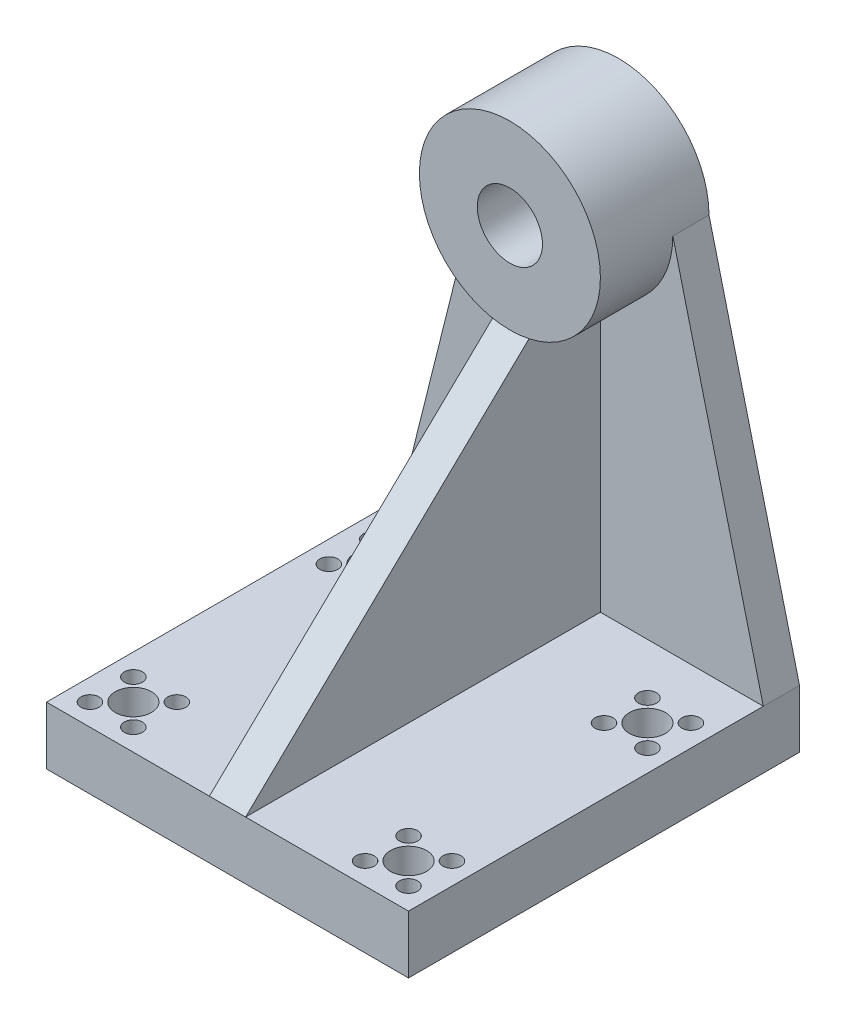
ISO-10303-21;
HEADER;
FILE_DESCRIPTION(('STEP AP214'),'2;1');
FILE_NAME('part.step','',(''),(''),'','','');
FILE_SCHEMA(('AUTOMOTIVE_DESIGN { 1 0 10303 214 1 1 1 1 }'));
ENDSEC;
DATA;
#1=APPLICATION_CONTEXT('core data for automotive mechanical design processes');
#2=APPLICATION_PROTOCOL_DEFINITION('international standard','automotive_design',2000,#1);
#3=PRODUCT_CONTEXT('',#1,'mechanical');
#4=PRODUCT('Part','Part','',(#3));
#5=PRODUCT_RELATED_PRODUCT_CATEGORY('part','',(#4));
#6=PRODUCT_DEFINITION_FORMATION('','',#4);
#7=PRODUCT_DEFINITION_CONTEXT('part definition',#1,'design');
#8=PRODUCT_DEFINITION('design','',#6,#7);
#9=PRODUCT_DEFINITION_SHAPE('','',#8);
#10=(LENGTH_UNIT() NAMED_UNIT(*) SI_UNIT(.MILLI.,.METRE.));
#11=(NAMED_UNIT(*) PLANE_ANGLE_UNIT() SI_UNIT($,.RADIAN.));
#12=(NAMED_UNIT(*) SI_UNIT($,.STERADIAN.) SOLID_ANGLE_UNIT());
#13=UNCERTAINTY_MEASURE_WITH_UNIT(LENGTH_MEASURE(1.E-05),#10,'distance_accuracy_value','');
#14=(GEOMETRIC_REPRESENTATION_CONTEXT(3) GLOBAL_UNCERTAINTY_ASSIGNED_CONTEXT((#13)) GLOBAL_UNIT_ASSIGNED_CONTEXT((#10,
#11,#12)) REPRESENTATION_CONTEXT('',''));
#15=CARTESIAN_POINT('',(0.,0.,0.));
#16=DIRECTION('',(0.,0.,1.));
#17=DIRECTION('',(1.,0.,0.));
#18=AXIS2_PLACEMENT_3D('',#15,#16,#17);
#19=CARTESIAN_POINT('',(0.,0.,25.));
#20=DIRECTION('',(0.,0.,-1.));
#21=DIRECTION('',(-1.,0.,0.));
#22=AXIS2_PLACEMENT_3D('',#19,#20,#21);
#23=PLANE('',#22);
#24=DIRECTION('',(0.,-1.,0.));
#25=VECTOR('',#24,1.);
#26=CARTESIAN_POINT('',(-12.5,0.,25.));
#27=LINE('',#26,#25);
#28=CARTESIAN_POINT('',(-12.5,-61.2372435695794,25.));
#29=VERTEX_POINT('',#28);
#30=CARTESIAN_POINT('',(-12.5,-250.,25.));
#31=VERTEX_POINT('',#30);
#32=EDGE_CURVE('E238',#29,#31,#27,.T.);
#33=ORIENTED_EDGE('',*,*,#32,.F.);
#34=CARTESIAN_POINT('',(0.,0.,25.));
#35=DIRECTION('',(0.,0.,1.));
#36=DIRECTION('',(-1.,0.,0.));
#37=AXIS2_PLACEMENT_3D('',#34,#35,#36);
#38=CIRCLE('',#37,62.5);
#39=CARTESIAN_POINT('',(-62.5,0.,25.));
#40=VERTEX_POINT('',#39);
#41=EDGE_CURVE('E236',#40,#29,#38,.T.);
#42=ORIENTED_EDGE('',*,*,#41,.F.);
#43=DIRECTION('',(0.242535625036333,0.970142500145332,0.));
#44=VECTOR('',#43,1.);
#45=CARTESIAN_POINT('',(-125.,-250.,25.));
#46=LINE('',#45,#44);
#47=CARTESIAN_POINT('',(-125.,-250.,25.));
#48=VERTEX_POINT('',#47);
#49=EDGE_CURVE('E291',#48,#40,#46,.T.);
#50=ORIENTED_EDGE('',*,*,#49,.F.);
#51=DIRECTION('',(-1.,0.,0.));
#52=VECTOR('',#51,1.);
#53=CARTESIAN_POINT('',(125.,-250.,25.));
#54=LINE('',#53,#52);
#55=EDGE_CURVE('E287',#31,#48,#54,.T.);
#56=ORIENTED_EDGE('',*,*,#55,.F.);
#57=EDGE_LOOP('',(#33,#42,#50,#56));
#58=FACE_BOUND('',#57,.T.);
#59=ADVANCED_FACE('F132',(#58),#23,.F.);
#60=CARTESIAN_POINT('',(0.,-250.,0.));
#61=DIRECTION('',(0.,-1.,0.));
#62=DIRECTION('',(0.,0.,-1.));
#63=AXIS2_PLACEMENT_3D('',#60,#61,#62);
#64=PLANE('',#63);
#65=CARTESIAN_POINT('',(-79.999999999998,-250.,60.));
#66=DIRECTION('',(0.,-1.,0.));
#67=DIRECTION('',(0.,0.,-1.));
#68=AXIS2_PLACEMENT_3D('',#65,#66,#67);
#69=CIRCLE('',#68,6.25000000000003);
#70=CARTESIAN_POINT('',(-79.999999999998,-250.,53.75));
#71=VERTEX_POINT('',#70);
#72=EDGE_CURVE('E468',#71,#71,#69,.T.);
#73=ORIENTED_EDGE('',*,*,#72,.T.);
#74=EDGE_LOOP('',(#73));
#75=FACE_BOUND('',#74,.T.);
#76=CARTESIAN_POINT('',(-79.9999999999983,-250.,90.0000000000001));
#77=DIRECTION('',(0.,-1.,0.));
#78=DIRECTION('',(0.,0.,-1.));
#79=AXIS2_PLACEMENT_3D('',#76,#77,#78);
#80=CIRCLE('',#79,6.25);
#81=CARTESIAN_POINT('',(-79.9999999999983,-250.,83.75));
#82=VERTEX_POINT('',#81);
#83=EDGE_CURVE('E461',#82,#82,#80,.T.);
#84=ORIENTED_EDGE('',*,*,#83,.T.);
#85=EDGE_LOOP('',(#84));
#86=FACE_BOUND('',#85,.T.);
#87=CARTESIAN_POINT('',(-95.0000000000001,-250.,240.));
#88=DIRECTION('',(0.,-1.,0.));
#89=DIRECTION('',(0.,0.,-1.));
#90=AXIS2_PLACEMENT_3D('',#87,#88,#89);
#91=CIRCLE('',#90,12.5);
#92=CARTESIAN_POINT('',(-95.0000000000001,-250.,227.5));
#93=VERTEX_POINT('',#92);
#94=EDGE_CURVE('E401',#93,#93,#91,.T.);
#95=ORIENTED_EDGE('',*,*,#94,.T.);
#96=EDGE_LOOP('',(#95));
#97=FACE_BOUND('',#96,.T.);
#98=CARTESIAN_POINT('',(-80.0000000000001,-250.,255.));
#99=DIRECTION('',(0.,-1.,0.));
#100=DIRECTION('',(0.,0.,-1.));
#101=AXIS2_PLACEMENT_3D('',#98,#99,#100);
#102=CIRCLE('',#101,6.25);
#103=CARTESIAN_POINT('',(-80.0000000000001,-250.,248.75));
#104=VERTEX_POINT('',#103);
#105=EDGE_CURVE('E407',#104,#104,#102,.T.);
#106=ORIENTED_EDGE('',*,*,#105,.T.);
#107=EDGE_LOOP('',(#106));
#108=FACE_BOUND('',#107,.T.);
#109=CARTESIAN_POINT('',(-110.,-250.,255.));
#110=DIRECTION('',(0.,-1.,0.));
#111=DIRECTION('',(0.,0.,-1.));
#112=AXIS2_PLACEMENT_3D('',#109,#110,#111);
#113=CIRCLE('',#112,6.25000000000004);
#114=CARTESIAN_POINT('',(-110.,-250.,248.75));
#115=VERTEX_POINT('',#114);
#116=EDGE_CURVE('E396',#115,#115,#113,.T.);
#117=ORIENTED_EDGE('',*,*,#116,.T.);
#118=EDGE_LOOP('',(#117));
#119=FACE_BOUND('',#118,.T.);
#120=CARTESIAN_POINT('',(-79.9999999999997,-250.,225.));
#121=DIRECTION('',(0.,-1.,0.));
#122=DIRECTION('',(0.,0.,-1.));
#123=AXIS2_PLACEMENT_3D('',#120,#121,#122);
#124=CIRCLE('',#123,6.25000000000003);
#125=CARTESIAN_POINT('',(-79.9999999999997,-250.,218.75));
#126=VERTEX_POINT('',#125);
#127=EDGE_CURVE('E420',#126,#126,#124,.T.);
#128=ORIENTED_EDGE('',*,*,#127,.T.);
#129=EDGE_LOOP('',(#128));
#130=FACE_BOUND('',#129,.T.);
#131=CARTESIAN_POINT('',(-94.9999999999983,-250.,75.0000000000001));
#132=DIRECTION('',(0.,-1.,0.));
#133=DIRECTION('',(0.,0.,-1.));
#134=AXIS2_PLACEMENT_3D('',#131,#132,#133);
#135=CIRCLE('',#134,12.5);
#136=CARTESIAN_POINT('',(-94.9999999999983,-250.,62.5000000000001));
#137=VERTEX_POINT('',#136);
#138=EDGE_CURVE('E497',#137,#137,#135,.T.);
#139=ORIENTED_EDGE('',*,*,#138,.T.);
#140=EDGE_LOOP('',(#139));
#141=FACE_BOUND('',#140,.T.);
#142=CARTESIAN_POINT('',(-109.999999999998,-250.,59.9999999999998));
#143=DIRECTION('',(0.,-1.,0.));
#144=DIRECTION('',(0.,0.,-1.));
#145=AXIS2_PLACEMENT_3D('',#142,#143,#144);
#146=CIRCLE('',#145,6.25);
#147=CARTESIAN_POINT('',(-109.999999999998,-250.,53.7499999999998));
#148=VERTEX_POINT('',#147);
#149=EDGE_CURVE('E485',#148,#148,#146,.T.);
#150=ORIENTED_EDGE('',*,*,#149,.T.);
#151=EDGE_LOOP('',(#150));
#152=FACE_BOUND('',#151,.T.);
#153=CARTESIAN_POINT('',(-109.999999999998,-250.,89.9999999999998));
#154=DIRECTION('',(0.,-1.,0.));
#155=DIRECTION('',(0.,0.,-1.));
#156=AXIS2_PLACEMENT_3D('',#153,#154,#155);
#157=CIRCLE('',#156,6.25000000000004);
#158=CARTESIAN_POINT('',(-109.999999999998,-250.,83.7499999999997));
#159=VERTEX_POINT('',#158);
#160=EDGE_CURVE('E492',#159,#159,#157,.T.);
#161=ORIENTED_EDGE('',*,*,#160,.T.);
#162=EDGE_LOOP('',(#161));
#163=FACE_BOUND('',#162,.T.);
#164=CARTESIAN_POINT('',(-110.,-250.,225.));
#165=DIRECTION('',(0.,-1.,0.));
#166=DIRECTION('',(0.,0.,-1.));
#167=AXIS2_PLACEMENT_3D('',#164,#165,#166);
#168=CIRCLE('',#167,6.25);
#169=CARTESIAN_POINT('',(-110.,-250.,218.75));
#170=VERTEX_POINT('',#169);
#171=EDGE_CURVE('E234',#170,#170,#168,.T.);
#172=ORIENTED_EDGE('',*,*,#171,.T.);
#173=EDGE_LOOP('',(#172));
#174=FACE_BOUND('',#173,.T.);
#175=DIRECTION('',(0.,0.,1.));
#176=VECTOR('',#175,1.);
#177=CARTESIAN_POINT('',(-12.5,-250.,0.));
#178=LINE('',#177,#176);
#179=CARTESIAN_POINT('',(-12.5,-250.,270.));
#180=VERTEX_POINT('',#179);
#181=EDGE_CURVE('E231',#31,#180,#178,.T.);
#182=ORIENTED_EDGE('',*,*,#181,.F.);
#183=ORIENTED_EDGE('',*,*,#55,.T.);
#184=DIRECTION('',(0.,0.,-1.));
#185=VECTOR('',#184,1.);
#186=CARTESIAN_POINT('',(-125.,-250.,0.));
#187=LINE('',#186,#185);
#188=CARTESIAN_POINT('',(-125.,-250.,270.));
#189=VERTEX_POINT('',#188);
#190=EDGE_CURVE('E255',#189,#48,#187,.T.);
#191=ORIENTED_EDGE('',*,*,#190,.F.);
#192=DIRECTION('',(-1.,0.,0.));
#193=VECTOR('',#192,1.);
#194=CARTESIAN_POINT('',(125.,-250.,270.));
#195=LINE('',#194,#193);
#196=EDGE_CURVE('E263',#180,#189,#195,.T.);
#197=ORIENTED_EDGE('',*,*,#196,.F.);
#198=EDGE_LOOP('',(#182,#183,#191,#197));
#199=FACE_BOUND('',#198,.T.);
#200=ADVANCED_FACE('F327',(#75,#86,#97,#108,#119,#130,#141,#152,#163,#174,#199),#64,.F.);
#201=CARTESIAN_POINT('',(0.,0.,75.));
#202=DIRECTION('',(0.,0.,1.));
#203=DIRECTION('',(1.,0.,0.));
#204=AXIS2_PLACEMENT_3D('',#201,#202,#203);
#205=PLANE('',#204);
#206=CARTESIAN_POINT('',(0.,0.,75.));
#207=DIRECTION('',(0.,0.,1.));
#208=DIRECTION('',(1.,0.,0.));
#209=AXIS2_PLACEMENT_3D('',#206,#207,#208);
#210=CIRCLE('',#209,62.5);
#211=CARTESIAN_POINT('',(0.,-62.5,75.));
#212=VERTEX_POINT('',#211);
#213=EDGE_CURVE('E12',#212,#212,#210,.T.);
#214=ORIENTED_EDGE('',*,*,#213,.T.);
#215=EDGE_LOOP('',(#214));
#216=FACE_BOUND('',#215,.T.);
#217=CARTESIAN_POINT('',(0.,0.,75.));
#218=DIRECTION('',(0.,0.,1.));
#219=DIRECTION('',(1.,0.,0.));
#220=AXIS2_PLACEMENT_3D('',#217,#218,#219);
#221=CIRCLE('',#220,22.5);
#222=CARTESIAN_POINT('',(22.5,0.,75.));
#223=VERTEX_POINT('',#222);
#224=EDGE_CURVE('E309',#223,#223,#221,.T.);
#225=ORIENTED_EDGE('',*,*,#224,.F.);
#226=EDGE_LOOP('',(#225));
#227=FACE_BOUND('',#226,.T.);
#228=ADVANCED_FACE('F325',(#216,#227),#205,.T.);
#229=CARTESIAN_POINT('',(0.,0.,0.));
#230=DIRECTION('',(0.,0.,1.));
#231=DIRECTION('',(1.,0.,0.));
#232=AXIS2_PLACEMENT_3D('',#229,#230,#231);
#233=PLANE('',#232);
#234=CARTESIAN_POINT('',(0.,0.,0.));
#235=DIRECTION('',(0.,0.,1.));
#236=DIRECTION('',(1.,0.,0.));
#237=AXIS2_PLACEMENT_3D('',#234,#235,#236);
#238=CIRCLE('',#237,22.5);
#239=CARTESIAN_POINT('',(22.5,0.,0.));
#240=VERTEX_POINT('',#239);
#241=EDGE_CURVE('E301',#240,#240,#238,.T.);
#242=ORIENTED_EDGE('',*,*,#241,.T.);
#243=EDGE_LOOP('',(#242));
#244=FACE_BOUND('',#243,.T.);
#245=DIRECTION('',(0.,1.,0.));
#246=VECTOR('',#245,1.);
#247=CARTESIAN_POINT('',(125.,-290.,0.));
#248=LINE('',#247,#246);
#249=CARTESIAN_POINT('',(125.,-290.,0.));
#250=VERTEX_POINT('',#249);
#251=CARTESIAN_POINT('',(125.,-250.,0.));
#252=VERTEX_POINT('',#251);
#253=EDGE_CURVE('E261',#250,#252,#248,.T.);
#254=ORIENTED_EDGE('',*,*,#253,.F.);
#255=DIRECTION('',(1.,0.,0.));
#256=VECTOR('',#255,1.);
#257=CARTESIAN_POINT('',(125.,-290.,0.));
#258=LINE('',#257,#256);
#259=CARTESIAN_POINT('',(-125.,-290.,0.));
#260=VERTEX_POINT('',#259);
#261=EDGE_CURVE('E259',#260,#250,#258,.T.);
#262=ORIENTED_EDGE('',*,*,#261,.F.);
#263=DIRECTION('',(0.,1.,0.));
#264=VECTOR('',#263,1.);
#265=CARTESIAN_POINT('',(-125.,-290.,0.));
#266=LINE('',#265,#264);
#267=CARTESIAN_POINT('',(-125.,-250.,0.));
#268=VERTEX_POINT('',#267);
#269=EDGE_CURVE('E272',#260,#268,#266,.T.);
#270=ORIENTED_EDGE('',*,*,#269,.T.);
#271=DIRECTION('',(0.242535625036333,0.970142500145332,0.));
#272=VECTOR('',#271,1.);
#273=CARTESIAN_POINT('',(-125.,-250.,0.));
#274=LINE('',#273,#272);
#275=CARTESIAN_POINT('',(-62.5,0.,0.));
#276=VERTEX_POINT('',#275);
#277=EDGE_CURVE('E297',#268,#276,#274,.T.);
#278=ORIENTED_EDGE('',*,*,#277,.T.);
#279=CARTESIAN_POINT('',(0.,0.,0.));
#280=DIRECTION('',(0.,0.,1.));
#281=DIRECTION('',(1.,0.,0.));
#282=AXIS2_PLACEMENT_3D('',#279,#280,#281);
#283=CIRCLE('',#282,62.5);
#284=CARTESIAN_POINT('',(62.5,0.,0.));
#285=VERTEX_POINT('',#284);
#286=EDGE_CURVE('E136',#285,#276,#283,.T.);
#287=ORIENTED_EDGE('',*,*,#286,.F.);
#288=DIRECTION('',(0.242535625036333,-0.970142500145332,0.));
#289=VECTOR('',#288,1.);
#290=CARTESIAN_POINT('',(62.5,0.,0.));
#291=LINE('',#290,#289);
#292=EDGE_CURVE('E281',#285,#252,#291,.T.);
#293=ORIENTED_EDGE('',*,*,#292,.T.);
#294=EDGE_LOOP('',(#254,#262,#270,#278,#287,#293));
#295=FACE_BOUND('',#294,.T.);
#296=ADVANCED_FACE('F315',(#244,#295),#233,.F.);
#297=CARTESIAN_POINT('',(0.,0.,75.));
#298=DIRECTION('',(0.,0.,-1.));
#299=DIRECTION('',(-1.,0.,0.));
#300=AXIS2_PLACEMENT_3D('',#297,#298,#299);
#301=CYLINDRICAL_SURFACE('',#300,62.5);
#302=CARTESIAN_POINT('',(0.,0.,9.99999999999999));
#303=DIRECTION('',(0.,-0.720833064901856,-0.693108716251785));
#304=DIRECTION('',(0.,0.693108716251785,-0.720833064901856));
#305=AXIS2_PLACEMENT_3D('',#302,#303,#304);
#306=ELLIPSE('',#305,90.1734439843571,62.5);
#307=CARTESIAN_POINT('',(12.5,-61.2372435695795,73.6867333123626));
#308=VERTEX_POINT('',#307);
#309=EDGE_CURVE('E221',#212,#308,#306,.F.);
#310=ORIENTED_EDGE('',*,*,#309,.T.);
#311=DIRECTION('',(0.,0.,-1.));
#312=VECTOR('',#311,1.);
#313=CARTESIAN_POINT('',(12.5,-61.2372435695794,75.));
#314=LINE('',#313,#312);
#315=CARTESIAN_POINT('',(12.5,-61.2372435695794,25.));
#316=VERTEX_POINT('',#315);
#317=EDGE_CURVE('E248',#308,#316,#314,.T.);
#318=ORIENTED_EDGE('',*,*,#317,.T.);
#319=CARTESIAN_POINT('',(62.5,0.,25.));
#320=VERTEX_POINT('',#319);
#321=EDGE_CURVE('E284',#316,#320,#38,.T.);
#322=ORIENTED_EDGE('',*,*,#321,.T.);
#323=DIRECTION('',(0.,0.,-1.));
#324=VECTOR('',#323,1.);
#325=CARTESIAN_POINT('',(62.5,0.,25.));
#326=LINE('',#325,#324);
#327=EDGE_CURVE('E294',#320,#285,#326,.T.);
#328=ORIENTED_EDGE('',*,*,#327,.T.);
#329=ORIENTED_EDGE('',*,*,#286,.T.);
#330=DIRECTION('',(0.,0.,-1.));
#331=VECTOR('',#330,1.);
#332=CARTESIAN_POINT('',(-62.5,0.,25.));
#333=LINE('',#332,#331);
#334=EDGE_CURVE('E155',#40,#276,#333,.T.);
#335=ORIENTED_EDGE('',*,*,#334,.F.);
#336=ORIENTED_EDGE('',*,*,#41,.T.);
#337=DIRECTION('',(0.,0.,-1.));
#338=VECTOR('',#337,1.);
#339=CARTESIAN_POINT('',(-12.5,-61.2372435695794,75.));
#340=LINE('',#339,#338);
#341=CARTESIAN_POINT('',(-12.5,-61.2372435695795,73.6867333123626));
#342=VERTEX_POINT('',#341);
#343=EDGE_CURVE('E228',#342,#29,#340,.T.);
#344=ORIENTED_EDGE('',*,*,#343,.F.);
#345=EDGE_CURVE('E217',#342,#212,#306,.F.);
#346=ORIENTED_EDGE('',*,*,#345,.T.);
#347=ORIENTED_EDGE('',*,*,#213,.F.);
#348=EDGE_LOOP('',(#310,#318,#322,#328,#329,#335,#336,#344,#346,#347));
#349=FACE_BOUND('',#348,.T.);
#350=ADVANCED_FACE('F134',(#349),#301,.T.);
#351=CARTESIAN_POINT('',(0.,0.,75.));
#352=DIRECTION('',(0.,0.,-1.));
#353=DIRECTION('',(-1.,0.,0.));
#354=AXIS2_PLACEMENT_3D('',#351,#352,#353);
#355=CYLINDRICAL_SURFACE('',#354,22.5);
#356=ORIENTED_EDGE('',*,*,#241,.F.);
#357=EDGE_LOOP('',(#356));
#358=FACE_BOUND('',#357,.T.);
#359=ORIENTED_EDGE('',*,*,#224,.T.);
#360=EDGE_LOOP('',(#359));
#361=FACE_BOUND('',#360,.T.);
#362=ADVANCED_FACE('F318',(#358,#361),#355,.F.);
#363=CARTESIAN_POINT('',(-125.,-250.,25.));
#364=DIRECTION('',(-0.970142500145332,0.242535625036333,0.));
#365=DIRECTION('',(-0.242535625036333,-0.970142500145332,0.));
#366=AXIS2_PLACEMENT_3D('',#363,#364,#365);
#367=PLANE('',#366);
#368=ORIENTED_EDGE('',*,*,#277,.F.);
#369=DIRECTION('',(0.,0.,-1.));
#370=VECTOR('',#369,1.);
#371=CARTESIAN_POINT('',(-125.,-250.,25.));
#372=LINE('',#371,#370);
#373=EDGE_CURVE('E302',#48,#268,#372,.T.);
#374=ORIENTED_EDGE('',*,*,#373,.F.);
#375=ORIENTED_EDGE('',*,*,#49,.T.);
#376=ORIENTED_EDGE('',*,*,#334,.T.);
#377=EDGE_LOOP('',(#368,#374,#375,#376));
#378=FACE_BOUND('',#377,.T.);
#379=ADVANCED_FACE('F321',(#378),#367,.T.);
#380=CARTESIAN_POINT('',(62.5,0.,25.));
#381=DIRECTION('',(0.970142500145332,0.242535625036333,0.));
#382=DIRECTION('',(-0.242535625036333,0.970142500145332,0.));
#383=AXIS2_PLACEMENT_3D('',#380,#381,#382);
#384=PLANE('',#383);
#385=ORIENTED_EDGE('',*,*,#292,.F.);
#386=ORIENTED_EDGE('',*,*,#327,.F.);
#387=DIRECTION('',(0.242535625036333,-0.970142500145332,0.));
#388=VECTOR('',#387,1.);
#389=CARTESIAN_POINT('',(62.5,0.,25.));
#390=LINE('',#389,#388);
#391=CARTESIAN_POINT('',(125.,-250.,25.));
#392=VERTEX_POINT('',#391);
#393=EDGE_CURVE('E283',#320,#392,#390,.T.);
#394=ORIENTED_EDGE('',*,*,#393,.T.);
#395=DIRECTION('',(0.,0.,-1.));
#396=VECTOR('',#395,1.);
#397=CARTESIAN_POINT('',(125.,-250.,25.));
#398=LINE('',#397,#396);
#399=EDGE_CURVE('E305',#392,#252,#398,.T.);
#400=ORIENTED_EDGE('',*,*,#399,.T.);
#401=EDGE_LOOP('',(#385,#386,#394,#400));
#402=FACE_BOUND('',#401,.T.);
#403=ADVANCED_FACE('F346',(#402),#384,.T.);
#404=ORIENTED_EDGE('',*,*,#321,.F.);
#405=DIRECTION('',(0.,-1.,0.));
#406=VECTOR('',#405,1.);
#407=CARTESIAN_POINT('',(12.5,0.,25.));
#408=LINE('',#407,#406);
#409=CARTESIAN_POINT('',(12.5,-250.,25.));
#410=VERTEX_POINT('',#409);
#411=EDGE_CURVE('E241',#316,#410,#408,.T.);
#412=ORIENTED_EDGE('',*,*,#411,.T.);
#413=EDGE_CURVE('E288',#392,#410,#54,.T.);
#414=ORIENTED_EDGE('',*,*,#413,.F.);
#415=ORIENTED_EDGE('',*,*,#393,.F.);
#416=EDGE_LOOP('',(#404,#412,#414,#415));
#417=FACE_BOUND('',#416,.T.);
#418=ADVANCED_FACE('F340',(#417),#23,.F.);
#419=CARTESIAN_POINT('',(80.0000000000002,-250.,255.));
#420=DIRECTION('',(0.,-1.,0.));
#421=DIRECTION('',(0.,0.,-1.));
#422=AXIS2_PLACEMENT_3D('',#419,#420,#421);
#423=CIRCLE('',#422,6.25000000000004);
#424=CARTESIAN_POINT('',(80.0000000000002,-250.,248.75));
#425=VERTEX_POINT('',#424);
#426=EDGE_CURVE('E456',#425,#425,#423,.T.);
#427=ORIENTED_EDGE('',*,*,#426,.T.);
#428=EDGE_LOOP('',(#427));
#429=FACE_BOUND('',#428,.T.);
#430=CARTESIAN_POINT('',(80.0000000000003,-250.,225.));
#431=DIRECTION('',(0.,-1.,0.));
#432=DIRECTION('',(0.,0.,-1.));
#433=AXIS2_PLACEMENT_3D('',#430,#431,#432);
#434=CIRCLE('',#433,6.25);
#435=CARTESIAN_POINT('',(80.0000000000003,-250.,218.75));
#436=VERTEX_POINT('',#435);
#437=EDGE_CURVE('E450',#436,#436,#434,.T.);
#438=ORIENTED_EDGE('',*,*,#437,.T.);
#439=EDGE_LOOP('',(#438));
#440=FACE_BOUND('',#439,.T.);
#441=CARTESIAN_POINT('',(110.000000000002,-250.,90.0000000000001));
#442=DIRECTION('',(0.,-1.,0.));
#443=DIRECTION('',(0.,0.,-1.));
#444=AXIS2_PLACEMENT_3D('',#441,#442,#443);
#445=CIRCLE('',#444,6.25);
#446=CARTESIAN_POINT('',(110.000000000002,-250.,83.75));
#447=VERTEX_POINT('',#446);
#448=EDGE_CURVE('E444',#447,#447,#445,.T.);
#449=ORIENTED_EDGE('',*,*,#448,.T.);
#450=EDGE_LOOP('',(#449));
#451=FACE_BOUND('',#450,.T.);
#452=CARTESIAN_POINT('',(110.000000000002,-250.,60.));
#453=DIRECTION('',(0.,-1.,0.));
#454=DIRECTION('',(0.,0.,-1.));
#455=AXIS2_PLACEMENT_3D('',#452,#453,#454);
#456=CIRCLE('',#455,6.25000000000003);
#457=CARTESIAN_POINT('',(110.000000000002,-250.,53.75));
#458=VERTEX_POINT('',#457);
#459=EDGE_CURVE('E437',#458,#458,#456,.T.);
#460=ORIENTED_EDGE('',*,*,#459,.T.);
#461=EDGE_LOOP('',(#460));
#462=FACE_BOUND('',#461,.T.);
#463=CARTESIAN_POINT('',(80.000000000002,-250.,59.9999999999998));
#464=DIRECTION('',(0.,-1.,0.));
#465=DIRECTION('',(0.,0.,-1.));
#466=AXIS2_PLACEMENT_3D('',#463,#464,#465);
#467=CIRCLE('',#466,6.25);
#468=CARTESIAN_POINT('',(80.000000000002,-250.,53.7499999999998));
#469=VERTEX_POINT('',#468);
#470=EDGE_CURVE('E480',#469,#469,#467,.T.);
#471=ORIENTED_EDGE('',*,*,#470,.T.);
#472=EDGE_LOOP('',(#471));
#473=FACE_BOUND('',#472,.T.);
#474=CARTESIAN_POINT('',(80.0000000000019,-250.,89.9999999999998));
#475=DIRECTION('',(0.,-1.,0.));
#476=DIRECTION('',(0.,0.,-1.));
#477=AXIS2_PLACEMENT_3D('',#474,#475,#476);
#478=CIRCLE('',#477,6.25000000000004);
#479=CARTESIAN_POINT('',(80.0000000000019,-250.,83.7499999999997));
#480=VERTEX_POINT('',#479);
#481=EDGE_CURVE('E474',#480,#480,#478,.T.);
#482=ORIENTED_EDGE('',*,*,#481,.T.);
#483=EDGE_LOOP('',(#482));
#484=FACE_BOUND('',#483,.T.);
#485=CARTESIAN_POINT('',(95.0000000000017,-250.,75.0000000000001));
#486=DIRECTION('',(0.,-1.,0.));
#487=DIRECTION('',(0.,0.,-1.));
#488=AXIS2_PLACEMENT_3D('',#485,#486,#487);
#489=CIRCLE('',#488,12.5);
#490=CARTESIAN_POINT('',(95.0000000000017,-250.,62.5000000000001));
#491=VERTEX_POINT('',#490);
#492=EDGE_CURVE('E389',#491,#491,#489,.T.);
#493=ORIENTED_EDGE('',*,*,#492,.T.);
#494=EDGE_LOOP('',(#493));
#495=FACE_BOUND('',#494,.T.);
#496=CARTESIAN_POINT('',(94.9999999999999,-250.,240.));
#497=DIRECTION('',(0.,-1.,0.));
#498=DIRECTION('',(0.,0.,-1.));
#499=AXIS2_PLACEMENT_3D('',#496,#497,#498);
#500=CIRCLE('',#499,12.5);
#501=CARTESIAN_POINT('',(94.9999999999999,-250.,227.5));
#502=VERTEX_POINT('',#501);
#503=EDGE_CURVE('E425',#502,#502,#500,.T.);
#504=ORIENTED_EDGE('',*,*,#503,.T.);
#505=EDGE_LOOP('',(#504));
#506=FACE_BOUND('',#505,.T.);
#507=CARTESIAN_POINT('',(110.,-250.,255.));
#508=DIRECTION('',(0.,-1.,0.));
#509=DIRECTION('',(0.,0.,-1.));
#510=AXIS2_PLACEMENT_3D('',#507,#508,#509);
#511=CIRCLE('',#510,6.25);
#512=CARTESIAN_POINT('',(110.,-250.,248.75));
#513=VERTEX_POINT('',#512);
#514=EDGE_CURVE('E431',#513,#513,#511,.T.);
#515=ORIENTED_EDGE('',*,*,#514,.T.);
#516=EDGE_LOOP('',(#515));
#517=FACE_BOUND('',#516,.T.);
#518=CARTESIAN_POINT('',(110.,-250.,225.));
#519=DIRECTION('',(0.,-1.,0.));
#520=DIRECTION('',(0.,0.,-1.));
#521=AXIS2_PLACEMENT_3D('',#518,#519,#520);
#522=CIRCLE('',#521,6.25000000000003);
#523=CARTESIAN_POINT('',(110.,-250.,218.75));
#524=VERTEX_POINT('',#523);
#525=EDGE_CURVE('E413',#524,#524,#522,.T.);
#526=ORIENTED_EDGE('',*,*,#525,.T.);
#527=EDGE_LOOP('',(#526));
#528=FACE_BOUND('',#527,.T.);
#529=ORIENTED_EDGE('',*,*,#413,.T.);
#530=DIRECTION('',(0.,0.,1.));
#531=VECTOR('',#530,1.);
#532=CARTESIAN_POINT('',(12.5,-250.,0.));
#533=LINE('',#532,#531);
#534=CARTESIAN_POINT('',(12.5,-250.,270.));
#535=VERTEX_POINT('',#534);
#536=EDGE_CURVE('E237',#410,#535,#533,.T.);
#537=ORIENTED_EDGE('',*,*,#536,.T.);
#538=CARTESIAN_POINT('',(125.,-250.,270.));
#539=VERTEX_POINT('',#538);
#540=EDGE_CURVE('E264',#539,#535,#195,.T.);
#541=ORIENTED_EDGE('',*,*,#540,.F.);
#542=DIRECTION('',(0.,0.,1.));
#543=VECTOR('',#542,1.);
#544=CARTESIAN_POINT('',(125.,-250.,0.));
#545=LINE('',#544,#543);
#546=EDGE_CURVE('E224',#392,#539,#545,.T.);
#547=ORIENTED_EDGE('',*,*,#546,.F.);
#548=EDGE_LOOP('',(#529,#537,#541,#547));
#549=FACE_BOUND('',#548,.T.);
#550=ADVANCED_FACE('F336',(#429,#440,#451,#462,#473,#484,#495,#506,#517,#528,#549),#64,.F.);
#551=CARTESIAN_POINT('',(125.,-290.,0.));
#552=DIRECTION('',(-1.,0.,0.));
#553=DIRECTION('',(0.,0.,1.));
#554=AXIS2_PLACEMENT_3D('',#551,#552,#553);
#555=PLANE('',#554);
#556=ORIENTED_EDGE('',*,*,#399,.F.);
#557=ORIENTED_EDGE('',*,*,#546,.T.);
#558=DIRECTION('',(0.,1.,0.));
#559=VECTOR('',#558,1.);
#560=CARTESIAN_POINT('',(125.,-290.,270.));
#561=LINE('',#560,#559);
#562=CARTESIAN_POINT('',(125.,-290.,270.));
#563=VERTEX_POINT('',#562);
#564=EDGE_CURVE('E278',#563,#539,#561,.T.);
#565=ORIENTED_EDGE('',*,*,#564,.F.);
#566=DIRECTION('',(0.,0.,1.));
#567=VECTOR('',#566,1.);
#568=CARTESIAN_POINT('',(125.,-290.,0.));
#569=LINE('',#568,#567);
#570=EDGE_CURVE('E251',#250,#563,#569,.T.);
#571=ORIENTED_EDGE('',*,*,#570,.F.);
#572=ORIENTED_EDGE('',*,*,#253,.T.);
#573=EDGE_LOOP('',(#556,#557,#565,#571,#572));
#574=FACE_BOUND('',#573,.T.);
#575=ADVANCED_FACE('F352',(#574),#555,.F.);
#576=CARTESIAN_POINT('',(125.,-290.,270.));
#577=DIRECTION('',(0.,0.,-1.));
#578=DIRECTION('',(-1.,0.,0.));
#579=AXIS2_PLACEMENT_3D('',#576,#577,#578);
#580=PLANE('',#579);
#581=ORIENTED_EDGE('',*,*,#540,.T.);
#582=EDGE_CURVE('E267',#535,#180,#195,.T.);
#583=ORIENTED_EDGE('',*,*,#582,.T.);
#584=ORIENTED_EDGE('',*,*,#196,.T.);
#585=DIRECTION('',(0.,1.,0.));
#586=VECTOR('',#585,1.);
#587=CARTESIAN_POINT('',(-125.,-290.,270.));
#588=LINE('',#587,#586);
#589=CARTESIAN_POINT('',(-125.,-290.,270.));
#590=VERTEX_POINT('',#589);
#591=EDGE_CURVE('E275',#590,#189,#588,.T.);
#592=ORIENTED_EDGE('',*,*,#591,.F.);
#593=DIRECTION('',(-1.,0.,0.));
#594=VECTOR('',#593,1.);
#595=CARTESIAN_POINT('',(125.,-290.,270.));
#596=LINE('',#595,#594);
#597=EDGE_CURVE('E254',#563,#590,#596,.T.);
#598=ORIENTED_EDGE('',*,*,#597,.F.);
#599=ORIENTED_EDGE('',*,*,#564,.T.);
#600=EDGE_LOOP('',(#581,#583,#584,#592,#598,#599));
#601=FACE_BOUND('',#600,.T.);
#602=ADVANCED_FACE('F541',(#601),#580,.F.);
#603=CARTESIAN_POINT('',(-125.,-290.,0.));
#604=DIRECTION('',(1.,0.,0.));
#605=DIRECTION('',(0.,0.,-1.));
#606=AXIS2_PLACEMENT_3D('',#603,#604,#605);
#607=PLANE('',#606);
#608=ORIENTED_EDGE('',*,*,#190,.T.);
#609=ORIENTED_EDGE('',*,*,#373,.T.);
#610=ORIENTED_EDGE('',*,*,#269,.F.);
#611=DIRECTION('',(0.,0.,-1.));
#612=VECTOR('',#611,1.);
#613=CARTESIAN_POINT('',(-125.,-290.,0.));
#614=LINE('',#613,#612);
#615=EDGE_CURVE('E257',#590,#260,#614,.T.);
#616=ORIENTED_EDGE('',*,*,#615,.F.);
#617=ORIENTED_EDGE('',*,*,#591,.T.);
#618=EDGE_LOOP('',(#608,#609,#610,#616,#617));
#619=FACE_BOUND('',#618,.T.);
#620=ADVANCED_FACE('F373',(#619),#607,.F.);
#621=CARTESIAN_POINT('',(0.,-290.,0.));
#622=DIRECTION('',(0.,-1.,0.));
#623=DIRECTION('',(0.,0.,-1.));
#624=AXIS2_PLACEMENT_3D('',#621,#622,#623);
#625=PLANE('',#624);
#626=CARTESIAN_POINT('',(80.0000000000002,-290.,255.));
#627=DIRECTION('',(0.,-1.,0.));
#628=DIRECTION('',(0.,0.,-1.));
#629=AXIS2_PLACEMENT_3D('',#626,#627,#628);
#630=CIRCLE('',#629,6.25000000000004);
#631=CARTESIAN_POINT('',(80.0000000000002,-290.,248.75));
#632=VERTEX_POINT('',#631);
#633=EDGE_CURVE('E434',#632,#632,#630,.T.);
#634=ORIENTED_EDGE('',*,*,#633,.F.);
#635=EDGE_LOOP('',(#634));
#636=FACE_BOUND('',#635,.T.);
#637=CARTESIAN_POINT('',(80.0000000000003,-290.,225.));
#638=DIRECTION('',(0.,-1.,0.));
#639=DIRECTION('',(0.,0.,-1.));
#640=AXIS2_PLACEMENT_3D('',#637,#638,#639);
#641=CIRCLE('',#640,6.25);
#642=CARTESIAN_POINT('',(80.0000000000003,-290.,218.75));
#643=VERTEX_POINT('',#642);
#644=EDGE_CURVE('E453',#643,#643,#641,.T.);
#645=ORIENTED_EDGE('',*,*,#644,.F.);
#646=EDGE_LOOP('',(#645));
#647=FACE_BOUND('',#646,.T.);
#648=CARTESIAN_POINT('',(110.000000000002,-290.,90.0000000000001));
#649=DIRECTION('',(0.,-1.,0.));
#650=DIRECTION('',(0.,0.,-1.));
#651=AXIS2_PLACEMENT_3D('',#648,#649,#650);
#652=CIRCLE('',#651,6.25);
#653=CARTESIAN_POINT('',(110.000000000002,-290.,83.75));
#654=VERTEX_POINT('',#653);
#655=EDGE_CURVE('E447',#654,#654,#652,.T.);
#656=ORIENTED_EDGE('',*,*,#655,.F.);
#657=EDGE_LOOP('',(#656));
#658=FACE_BOUND('',#657,.T.);
#659=CARTESIAN_POINT('',(110.000000000002,-290.,60.));
#660=DIRECTION('',(0.,-1.,0.));
#661=DIRECTION('',(0.,0.,-1.));
#662=AXIS2_PLACEMENT_3D('',#659,#660,#661);
#663=CIRCLE('',#662,6.25000000000003);
#664=CARTESIAN_POINT('',(110.000000000002,-290.,53.75));
#665=VERTEX_POINT('',#664);
#666=EDGE_CURVE('E440',#665,#665,#663,.T.);
#667=ORIENTED_EDGE('',*,*,#666,.F.);
#668=EDGE_LOOP('',(#667));
#669=FACE_BOUND('',#668,.T.);
#670=CARTESIAN_POINT('',(80.000000000002,-290.,59.9999999999998));
#671=DIRECTION('',(0.,-1.,0.));
#672=DIRECTION('',(0.,0.,-1.));
#673=AXIS2_PLACEMENT_3D('',#670,#671,#672);
#674=CIRCLE('',#673,6.25);
#675=CARTESIAN_POINT('',(80.000000000002,-290.,53.7499999999998));
#676=VERTEX_POINT('',#675);
#677=EDGE_CURVE('E441',#676,#676,#674,.T.);
#678=ORIENTED_EDGE('',*,*,#677,.F.);
#679=EDGE_LOOP('',(#678));
#680=FACE_BOUND('',#679,.T.);
#681=CARTESIAN_POINT('',(80.0000000000019,-290.,89.9999999999998));
#682=DIRECTION('',(0.,-1.,0.));
#683=DIRECTION('',(0.,0.,-1.));
#684=AXIS2_PLACEMENT_3D('',#681,#682,#683);
#685=CIRCLE('',#684,6.25000000000004);
#686=CARTESIAN_POINT('',(80.0000000000019,-290.,83.7499999999997));
#687=VERTEX_POINT('',#686);
#688=EDGE_CURVE('E477',#687,#687,#685,.T.);
#689=ORIENTED_EDGE('',*,*,#688,.F.);
#690=EDGE_LOOP('',(#689));
#691=FACE_BOUND('',#690,.T.);
#692=CARTESIAN_POINT('',(-79.999999999998,-290.,60.));
#693=DIRECTION('',(0.,-1.,0.));
#694=DIRECTION('',(0.,0.,-1.));
#695=AXIS2_PLACEMENT_3D('',#692,#693,#694);
#696=CIRCLE('',#695,6.25000000000003);
#697=CARTESIAN_POINT('',(-79.999999999998,-290.,53.75));
#698=VERTEX_POINT('',#697);
#699=EDGE_CURVE('E471',#698,#698,#696,.T.);
#700=ORIENTED_EDGE('',*,*,#699,.F.);
#701=EDGE_LOOP('',(#700));
#702=FACE_BOUND('',#701,.T.);
#703=CARTESIAN_POINT('',(-79.9999999999983,-290.,90.0000000000001));
#704=DIRECTION('',(0.,-1.,0.));
#705=DIRECTION('',(0.,0.,-1.));
#706=AXIS2_PLACEMENT_3D('',#703,#704,#705);
#707=CIRCLE('',#706,6.25);
#708=CARTESIAN_POINT('',(-79.9999999999983,-290.,83.75));
#709=VERTEX_POINT('',#708);
#710=EDGE_CURVE('E464',#709,#709,#707,.T.);
#711=ORIENTED_EDGE('',*,*,#710,.F.);
#712=EDGE_LOOP('',(#711));
#713=FACE_BOUND('',#712,.T.);
#714=CARTESIAN_POINT('',(-95.0000000000001,-290.,240.));
#715=DIRECTION('',(0.,-1.,0.));
#716=DIRECTION('',(0.,0.,-1.));
#717=AXIS2_PLACEMENT_3D('',#714,#715,#716);
#718=CIRCLE('',#717,12.5);
#719=CARTESIAN_POINT('',(-95.0000000000001,-290.,227.5));
#720=VERTEX_POINT('',#719);
#721=EDGE_CURVE('E393',#720,#720,#718,.T.);
#722=ORIENTED_EDGE('',*,*,#721,.F.);
#723=EDGE_LOOP('',(#722));
#724=FACE_BOUND('',#723,.T.);
#725=CARTESIAN_POINT('',(-80.0000000000001,-290.,255.));
#726=DIRECTION('',(0.,-1.,0.));
#727=DIRECTION('',(0.,0.,-1.));
#728=AXIS2_PLACEMENT_3D('',#725,#726,#727);
#729=CIRCLE('',#728,6.25);
#730=CARTESIAN_POINT('',(-80.0000000000001,-290.,248.75));
#731=VERTEX_POINT('',#730);
#732=EDGE_CURVE('E404',#731,#731,#729,.T.);
#733=ORIENTED_EDGE('',*,*,#732,.F.);
#734=EDGE_LOOP('',(#733));
#735=FACE_BOUND('',#734,.T.);
#736=CARTESIAN_POINT('',(95.0000000000017,-290.,75.0000000000001));
#737=DIRECTION('',(0.,-1.,0.));
#738=DIRECTION('',(0.,0.,-1.));
#739=AXIS2_PLACEMENT_3D('',#736,#737,#738);
#740=CIRCLE('',#739,12.5);
#741=CARTESIAN_POINT('',(95.0000000000017,-290.,62.5000000000001));
#742=VERTEX_POINT('',#741);
#743=EDGE_CURVE('E392',#742,#742,#740,.T.);
#744=ORIENTED_EDGE('',*,*,#743,.F.);
#745=EDGE_LOOP('',(#744));
#746=FACE_BOUND('',#745,.T.);
#747=CARTESIAN_POINT('',(-110.,-290.,255.));
#748=DIRECTION('',(0.,-1.,0.));
#749=DIRECTION('',(0.,0.,-1.));
#750=AXIS2_PLACEMENT_3D('',#747,#748,#749);
#751=CIRCLE('',#750,6.25000000000004);
#752=CARTESIAN_POINT('',(-110.,-290.,248.75));
#753=VERTEX_POINT('',#752);
#754=EDGE_CURVE('E386',#753,#753,#751,.T.);
#755=ORIENTED_EDGE('',*,*,#754,.F.);
#756=EDGE_LOOP('',(#755));
#757=FACE_BOUND('',#756,.T.);
#758=CARTESIAN_POINT('',(94.9999999999999,-290.,240.));
#759=DIRECTION('',(0.,-1.,0.));
#760=DIRECTION('',(0.,0.,-1.));
#761=AXIS2_PLACEMENT_3D('',#758,#759,#760);
#762=CIRCLE('',#761,12.5);
#763=CARTESIAN_POINT('',(94.9999999999999,-290.,227.5));
#764=VERTEX_POINT('',#763);
#765=EDGE_CURVE('E417',#764,#764,#762,.T.);
#766=ORIENTED_EDGE('',*,*,#765,.F.);
#767=EDGE_LOOP('',(#766));
#768=FACE_BOUND('',#767,.T.);
#769=CARTESIAN_POINT('',(110.,-290.,255.));
#770=DIRECTION('',(0.,-1.,0.));
#771=DIRECTION('',(0.,0.,-1.));
#772=AXIS2_PLACEMENT_3D('',#769,#770,#771);
#773=CIRCLE('',#772,6.25);
#774=CARTESIAN_POINT('',(110.,-290.,248.75));
#775=VERTEX_POINT('',#774);
#776=EDGE_CURVE('E428',#775,#775,#773,.T.);
#777=ORIENTED_EDGE('',*,*,#776,.F.);
#778=EDGE_LOOP('',(#777));
#779=FACE_BOUND('',#778,.T.);
#780=CARTESIAN_POINT('',(110.,-290.,225.));
#781=DIRECTION('',(0.,-1.,0.));
#782=DIRECTION('',(0.,0.,-1.));
#783=AXIS2_PLACEMENT_3D('',#780,#781,#782);
#784=CIRCLE('',#783,6.25000000000003);
#785=CARTESIAN_POINT('',(110.,-290.,218.75));
#786=VERTEX_POINT('',#785);
#787=EDGE_CURVE('E416',#786,#786,#784,.T.);
#788=ORIENTED_EDGE('',*,*,#787,.F.);
#789=EDGE_LOOP('',(#788));
#790=FACE_BOUND('',#789,.T.);
#791=CARTESIAN_POINT('',(-79.9999999999997,-290.,225.));
#792=DIRECTION('',(0.,-1.,0.));
#793=DIRECTION('',(0.,0.,-1.));
#794=AXIS2_PLACEMENT_3D('',#791,#792,#793);
#795=CIRCLE('',#794,6.25000000000003);
#796=CARTESIAN_POINT('',(-79.9999999999997,-290.,218.75));
#797=VERTEX_POINT('',#796);
#798=EDGE_CURVE('E410',#797,#797,#795,.T.);
#799=ORIENTED_EDGE('',*,*,#798,.F.);
#800=EDGE_LOOP('',(#799));
#801=FACE_BOUND('',#800,.T.);
#802=CARTESIAN_POINT('',(-94.9999999999983,-290.,75.0000000000001));
#803=DIRECTION('',(0.,-1.,0.));
#804=DIRECTION('',(0.,0.,-1.));
#805=AXIS2_PLACEMENT_3D('',#802,#803,#804);
#806=CIRCLE('',#805,12.5);
#807=CARTESIAN_POINT('',(-94.9999999999983,-290.,62.5000000000001));
#808=VERTEX_POINT('',#807);
#809=EDGE_CURVE('E489',#808,#808,#806,.T.);
#810=ORIENTED_EDGE('',*,*,#809,.F.);
#811=EDGE_LOOP('',(#810));
#812=FACE_BOUND('',#811,.T.);
#813=CARTESIAN_POINT('',(-109.999999999998,-290.,59.9999999999998));
#814=DIRECTION('',(0.,-1.,0.));
#815=DIRECTION('',(0.,0.,-1.));
#816=AXIS2_PLACEMENT_3D('',#813,#814,#815);
#817=CIRCLE('',#816,6.25);
#818=CARTESIAN_POINT('',(-109.999999999998,-290.,53.7499999999998));
#819=VERTEX_POINT('',#818);
#820=EDGE_CURVE('E488',#819,#819,#817,.T.);
#821=ORIENTED_EDGE('',*,*,#820,.F.);
#822=EDGE_LOOP('',(#821));
#823=FACE_BOUND('',#822,.T.);
#824=CARTESIAN_POINT('',(-109.999999999998,-290.,89.9999999999998));
#825=DIRECTION('',(0.,-1.,0.));
#826=DIRECTION('',(0.,0.,-1.));
#827=AXIS2_PLACEMENT_3D('',#824,#825,#826);
#828=CIRCLE('',#827,6.25000000000004);
#829=CARTESIAN_POINT('',(-109.999999999998,-290.,83.7499999999997));
#830=VERTEX_POINT('',#829);
#831=EDGE_CURVE('E465',#830,#830,#828,.T.);
#832=ORIENTED_EDGE('',*,*,#831,.F.);
#833=EDGE_LOOP('',(#832));
#834=FACE_BOUND('',#833,.T.);
#835=CARTESIAN_POINT('',(-110.,-290.,225.));
#836=DIRECTION('',(0.,-1.,0.));
#837=DIRECTION('',(0.,0.,-1.));
#838=AXIS2_PLACEMENT_3D('',#835,#836,#837);
#839=CIRCLE('',#838,6.25);
#840=CARTESIAN_POINT('',(-110.,-290.,218.75));
#841=VERTEX_POINT('',#840);
#842=EDGE_CURVE('E383',#841,#841,#839,.T.);
#843=ORIENTED_EDGE('',*,*,#842,.F.);
#844=EDGE_LOOP('',(#843));
#845=FACE_BOUND('',#844,.T.);
#846=ORIENTED_EDGE('',*,*,#597,.T.);
#847=ORIENTED_EDGE('',*,*,#615,.T.);
#848=ORIENTED_EDGE('',*,*,#261,.T.);
#849=ORIENTED_EDGE('',*,*,#570,.T.);
#850=EDGE_LOOP('',(#846,#847,#848,#849));
#851=FACE_BOUND('',#850,.T.);
#852=ADVANCED_FACE('F368',(#636,#647,#658,#669,#680,#691,#702,#713,#724,#735,#746,#757,#768,
#779,#790,#801,#812,#823,#834,#845,#851),#625,.T.);
#853=CARTESIAN_POINT('',(0.,-250.,270.));
#854=DIRECTION('',(0.,-0.720833064901856,-0.693108716251785));
#855=DIRECTION('',(0.,0.693108716251785,-0.720833064901856));
#856=AXIS2_PLACEMENT_3D('',#853,#854,#855);
#857=PLANE('',#856);
#858=ORIENTED_EDGE('',*,*,#345,.F.);
#859=DIRECTION('',(0.,0.693108716251785,-0.720833064901856));
#860=VECTOR('',#859,1.);
#861=CARTESIAN_POINT('',(-12.5,-250.,270.));
#862=LINE('',#861,#860);
#863=EDGE_CURVE('E147',#180,#342,#862,.T.);
#864=ORIENTED_EDGE('',*,*,#863,.F.);
#865=ORIENTED_EDGE('',*,*,#582,.F.);
#866=DIRECTION('',(0.,0.693108716251785,-0.720833064901856));
#867=VECTOR('',#866,1.);
#868=CARTESIAN_POINT('',(12.5,-250.,270.));
#869=LINE('',#868,#867);
#870=EDGE_CURVE('E233',#535,#308,#869,.T.);
#871=ORIENTED_EDGE('',*,*,#870,.T.);
#872=ORIENTED_EDGE('',*,*,#309,.F.);
#873=EDGE_LOOP('',(#858,#864,#865,#871,#872));
#874=FACE_BOUND('',#873,.T.);
#875=ADVANCED_FACE('F218',(#874),#857,.F.);
#876=CARTESIAN_POINT('',(12.5,-113.75,135.));
#877=DIRECTION('',(1.,0.,0.));
#878=DIRECTION('',(0.,0.,-1.));
#879=AXIS2_PLACEMENT_3D('',#876,#877,#878);
#880=PLANE('',#879);
#881=ORIENTED_EDGE('',*,*,#317,.F.);
#882=ORIENTED_EDGE('',*,*,#870,.F.);
#883=ORIENTED_EDGE('',*,*,#536,.F.);
#884=ORIENTED_EDGE('',*,*,#411,.F.);
#885=EDGE_LOOP('',(#881,#882,#883,#884));
#886=FACE_BOUND('',#885,.T.);
#887=ADVANCED_FACE('F527',(#886),#880,.T.);
#888=CARTESIAN_POINT('',(-12.5,-113.75,135.));
#889=DIRECTION('',(1.,0.,0.));
#890=DIRECTION('',(0.,0.,-1.));
#891=AXIS2_PLACEMENT_3D('',#888,#889,#890);
#892=PLANE('',#891);
#893=ORIENTED_EDGE('',*,*,#863,.T.);
#894=ORIENTED_EDGE('',*,*,#343,.T.);
#895=ORIENTED_EDGE('',*,*,#32,.T.);
#896=ORIENTED_EDGE('',*,*,#181,.T.);
#897=EDGE_LOOP('',(#893,#894,#895,#896));
#898=FACE_BOUND('',#897,.T.);
#899=ADVANCED_FACE('F227',(#898),#892,.F.);
#900=CARTESIAN_POINT('',(-110.,-250.,225.));
#901=DIRECTION('',(0.,-1.,0.));
#902=DIRECTION('',(0.,0.,-1.));
#903=AXIS2_PLACEMENT_3D('',#900,#901,#902);
#904=CYLINDRICAL_SURFACE('',#903,6.25);
#905=ORIENTED_EDGE('',*,*,#171,.F.);
#906=EDGE_LOOP('',(#905));
#907=FACE_BOUND('',#906,.T.);
#908=ORIENTED_EDGE('',*,*,#842,.T.);
#909=EDGE_LOOP('',(#908));
#910=FACE_BOUND('',#909,.T.);
#911=ADVANCED_FACE('F515',(#907,#910),#904,.F.);
#912=CARTESIAN_POINT('',(-109.999999999998,-250.,89.9999999999998));
#913=DIRECTION('',(0.,-1.,0.));
#914=DIRECTION('',(0.,0.,-1.));
#915=AXIS2_PLACEMENT_3D('',#912,#913,#914);
#916=CYLINDRICAL_SURFACE('',#915,6.25000000000004);
#917=ORIENTED_EDGE('',*,*,#160,.F.);
#918=EDGE_LOOP('',(#917));
#919=FACE_BOUND('',#918,.T.);
#920=ORIENTED_EDGE('',*,*,#831,.T.);
#921=EDGE_LOOP('',(#920));
#922=FACE_BOUND('',#921,.T.);
#923=ADVANCED_FACE('F517',(#919,#922),#916,.F.);
#924=CARTESIAN_POINT('',(-109.999999999998,-250.,59.9999999999998));
#925=DIRECTION('',(0.,-1.,0.));
#926=DIRECTION('',(0.,0.,-1.));
#927=AXIS2_PLACEMENT_3D('',#924,#925,#926);
#928=CYLINDRICAL_SURFACE('',#927,6.25);
#929=ORIENTED_EDGE('',*,*,#149,.F.);
#930=EDGE_LOOP('',(#929));
#931=FACE_BOUND('',#930,.T.);
#932=ORIENTED_EDGE('',*,*,#820,.T.);
#933=EDGE_LOOP('',(#932));
#934=FACE_BOUND('',#933,.T.);
#935=ADVANCED_FACE('F524',(#931,#934),#928,.F.);
#936=CARTESIAN_POINT('',(-94.9999999999983,-250.,75.0000000000001));
#937=DIRECTION('',(0.,-1.,0.));
#938=DIRECTION('',(0.,0.,-1.));
#939=AXIS2_PLACEMENT_3D('',#936,#937,#938);
#940=CYLINDRICAL_SURFACE('',#939,12.5);
#941=ORIENTED_EDGE('',*,*,#138,.F.);
#942=EDGE_LOOP('',(#941));
#943=FACE_BOUND('',#942,.T.);
#944=ORIENTED_EDGE('',*,*,#809,.T.);
#945=EDGE_LOOP('',(#944));
#946=FACE_BOUND('',#945,.T.);
#947=ADVANCED_FACE('F503',(#943,#946),#940,.F.);
#948=CARTESIAN_POINT('',(-79.9999999999997,-250.,225.));
#949=DIRECTION('',(0.,-1.,0.));
#950=DIRECTION('',(0.,0.,-1.));
#951=AXIS2_PLACEMENT_3D('',#948,#949,#950);
#952=CYLINDRICAL_SURFACE('',#951,6.25000000000003);
#953=ORIENTED_EDGE('',*,*,#127,.F.);
#954=EDGE_LOOP('',(#953));
#955=FACE_BOUND('',#954,.T.);
#956=ORIENTED_EDGE('',*,*,#798,.T.);
#957=EDGE_LOOP('',(#956));
#958=FACE_BOUND('',#957,.T.);
#959=ADVANCED_FACE('F672',(#955,#958),#952,.F.);
#960=CARTESIAN_POINT('',(110.,-250.,225.));
#961=DIRECTION('',(0.,-1.,0.));
#962=DIRECTION('',(0.,0.,-1.));
#963=AXIS2_PLACEMENT_3D('',#960,#961,#962);
#964=CYLINDRICAL_SURFACE('',#963,6.25000000000003);
#965=ORIENTED_EDGE('',*,*,#525,.F.);
#966=EDGE_LOOP('',(#965));
#967=FACE_BOUND('',#966,.T.);
#968=ORIENTED_EDGE('',*,*,#787,.T.);
#969=EDGE_LOOP('',(#968));
#970=FACE_BOUND('',#969,.T.);
#971=ADVANCED_FACE('F681',(#967,#970),#964,.F.);
#972=CARTESIAN_POINT('',(110.,-250.,255.));
#973=DIRECTION('',(0.,-1.,0.));
#974=DIRECTION('',(0.,0.,-1.));
#975=AXIS2_PLACEMENT_3D('',#972,#973,#974);
#976=CYLINDRICAL_SURFACE('',#975,6.25);
#977=ORIENTED_EDGE('',*,*,#514,.F.);
#978=EDGE_LOOP('',(#977));
#979=FACE_BOUND('',#978,.T.);
#980=ORIENTED_EDGE('',*,*,#776,.T.);
#981=EDGE_LOOP('',(#980));
#982=FACE_BOUND('',#981,.T.);
#983=ADVANCED_FACE('F690',(#979,#982),#976,.F.);
#984=CARTESIAN_POINT('',(94.9999999999999,-250.,240.));
#985=DIRECTION('',(0.,-1.,0.));
#986=DIRECTION('',(0.,0.,-1.));
#987=AXIS2_PLACEMENT_3D('',#984,#985,#986);
#988=CYLINDRICAL_SURFACE('',#987,12.5);
#989=ORIENTED_EDGE('',*,*,#503,.F.);
#990=EDGE_LOOP('',(#989));
#991=FACE_BOUND('',#990,.T.);
#992=ORIENTED_EDGE('',*,*,#765,.T.);
#993=EDGE_LOOP('',(#992));
#994=FACE_BOUND('',#993,.T.);
#995=ADVANCED_FACE('F699',(#991,#994),#988,.F.);
#996=CARTESIAN_POINT('',(-110.,-250.,255.));
#997=DIRECTION('',(0.,-1.,0.));
#998=DIRECTION('',(0.,0.,-1.));
#999=AXIS2_PLACEMENT_3D('',#996,#997,#998);
#1000=CYLINDRICAL_SURFACE('',#999,6.25000000000004);
#1001=ORIENTED_EDGE('',*,*,#116,.F.);
#1002=EDGE_LOOP('',(#1001));
#1003=FACE_BOUND('',#1002,.T.);
#1004=ORIENTED_EDGE('',*,*,#754,.T.);
#1005=EDGE_LOOP('',(#1004));
#1006=FACE_BOUND('',#1005,.T.);
#1007=ADVANCED_FACE('F708',(#1003,#1006),#1000,.F.);
#1008=CARTESIAN_POINT('',(95.0000000000017,-250.,75.0000000000001));
#1009=DIRECTION('',(0.,-1.,0.));
#1010=DIRECTION('',(0.,0.,-1.));
#1011=AXIS2_PLACEMENT_3D('',#1008,#1009,#1010);
#1012=CYLINDRICAL_SURFACE('',#1011,12.5);
#1013=ORIENTED_EDGE('',*,*,#492,.F.);
#1014=EDGE_LOOP('',(#1013));
#1015=FACE_BOUND('',#1014,.T.);
#1016=ORIENTED_EDGE('',*,*,#743,.T.);
#1017=EDGE_LOOP('',(#1016));
#1018=FACE_BOUND('',#1017,.T.);
#1019=ADVANCED_FACE('F532',(#1015,#1018),#1012,.F.);
#1020=CARTESIAN_POINT('',(-80.0000000000001,-250.,255.));
#1021=DIRECTION('',(0.,-1.,0.));
#1022=DIRECTION('',(0.,0.,-1.));
#1023=AXIS2_PLACEMENT_3D('',#1020,#1021,#1022);
#1024=CYLINDRICAL_SURFACE('',#1023,6.25);
#1025=ORIENTED_EDGE('',*,*,#105,.F.);
#1026=EDGE_LOOP('',(#1025));
#1027=FACE_BOUND('',#1026,.T.);
#1028=ORIENTED_EDGE('',*,*,#732,.T.);
#1029=EDGE_LOOP('',(#1028));
#1030=FACE_BOUND('',#1029,.T.);
#1031=ADVANCED_FACE('F724',(#1027,#1030),#1024,.F.);
#1032=CARTESIAN_POINT('',(-95.0000000000001,-250.,240.));
#1033=DIRECTION('',(0.,-1.,0.));
#1034=DIRECTION('',(0.,0.,-1.));
#1035=AXIS2_PLACEMENT_3D('',#1032,#1033,#1034);
#1036=CYLINDRICAL_SURFACE('',#1035,12.5);
#1037=ORIENTED_EDGE('',*,*,#94,.F.);
#1038=EDGE_LOOP('',(#1037));
#1039=FACE_BOUND('',#1038,.T.);
#1040=ORIENTED_EDGE('',*,*,#721,.T.);
#1041=EDGE_LOOP('',(#1040));
#1042=FACE_BOUND('',#1041,.T.);
#1043=ADVANCED_FACE('F732',(#1039,#1042),#1036,.F.);
#1044=CARTESIAN_POINT('',(-79.9999999999983,-250.,90.0000000000001));
#1045=DIRECTION('',(0.,-1.,0.));
#1046=DIRECTION('',(0.,0.,-1.));
#1047=AXIS2_PLACEMENT_3D('',#1044,#1045,#1046);
#1048=CYLINDRICAL_SURFACE('',#1047,6.25);
#1049=ORIENTED_EDGE('',*,*,#83,.F.);
#1050=EDGE_LOOP('',(#1049));
#1051=FACE_BOUND('',#1050,.T.);
#1052=ORIENTED_EDGE('',*,*,#710,.T.);
#1053=EDGE_LOOP('',(#1052));
#1054=FACE_BOUND('',#1053,.T.);
#1055=ADVANCED_FACE('F741',(#1051,#1054),#1048,.F.);
#1056=CARTESIAN_POINT('',(-79.999999999998,-250.,60.));
#1057=DIRECTION('',(0.,-1.,0.));
#1058=DIRECTION('',(0.,0.,-1.));
#1059=AXIS2_PLACEMENT_3D('',#1056,#1057,#1058);
#1060=CYLINDRICAL_SURFACE('',#1059,6.25000000000003);
#1061=ORIENTED_EDGE('',*,*,#72,.F.);
#1062=EDGE_LOOP('',(#1061));
#1063=FACE_BOUND('',#1062,.T.);
#1064=ORIENTED_EDGE('',*,*,#699,.T.);
#1065=EDGE_LOOP('',(#1064));
#1066=FACE_BOUND('',#1065,.T.);
#1067=ADVANCED_FACE('F750',(#1063,#1066),#1060,.F.);
#1068=CARTESIAN_POINT('',(80.0000000000019,-250.,89.9999999999998));
#1069=DIRECTION('',(0.,-1.,0.));
#1070=DIRECTION('',(0.,0.,-1.));
#1071=AXIS2_PLACEMENT_3D('',#1068,#1069,#1070);
#1072=CYLINDRICAL_SURFACE('',#1071,6.25000000000004);
#1073=ORIENTED_EDGE('',*,*,#481,.F.);
#1074=EDGE_LOOP('',(#1073));
#1075=FACE_BOUND('',#1074,.T.);
#1076=ORIENTED_EDGE('',*,*,#688,.T.);
#1077=EDGE_LOOP('',(#1076));
#1078=FACE_BOUND('',#1077,.T.);
#1079=ADVANCED_FACE('F759',(#1075,#1078),#1072,.F.);
#1080=CARTESIAN_POINT('',(80.000000000002,-250.,59.9999999999998));
#1081=DIRECTION('',(0.,-1.,0.));
#1082=DIRECTION('',(0.,0.,-1.));
#1083=AXIS2_PLACEMENT_3D('',#1080,#1081,#1082);
#1084=CYLINDRICAL_SURFACE('',#1083,6.25);
#1085=ORIENTED_EDGE('',*,*,#470,.F.);
#1086=EDGE_LOOP('',(#1085));
#1087=FACE_BOUND('',#1086,.T.);
#1088=ORIENTED_EDGE('',*,*,#677,.T.);
#1089=EDGE_LOOP('',(#1088));
#1090=FACE_BOUND('',#1089,.T.);
#1091=ADVANCED_FACE('F768',(#1087,#1090),#1084,.F.);
#1092=CARTESIAN_POINT('',(110.000000000002,-250.,60.));
#1093=DIRECTION('',(0.,-1.,0.));
#1094=DIRECTION('',(0.,0.,-1.));
#1095=AXIS2_PLACEMENT_3D('',#1092,#1093,#1094);
#1096=CYLINDRICAL_SURFACE('',#1095,6.25000000000003);
#1097=ORIENTED_EDGE('',*,*,#459,.F.);
#1098=EDGE_LOOP('',(#1097));
#1099=FACE_BOUND('',#1098,.T.);
#1100=ORIENTED_EDGE('',*,*,#666,.T.);
#1101=EDGE_LOOP('',(#1100));
#1102=FACE_BOUND('',#1101,.T.);
#1103=ADVANCED_FACE('F777',(#1099,#1102),#1096,.F.);
#1104=CARTESIAN_POINT('',(110.000000000002,-250.,90.0000000000001));
#1105=DIRECTION('',(0.,-1.,0.));
#1106=DIRECTION('',(0.,0.,-1.));
#1107=AXIS2_PLACEMENT_3D('',#1104,#1105,#1106);
#1108=CYLINDRICAL_SURFACE('',#1107,6.25);
#1109=ORIENTED_EDGE('',*,*,#448,.F.);
#1110=EDGE_LOOP('',(#1109));
#1111=FACE_BOUND('',#1110,.T.);
#1112=ORIENTED_EDGE('',*,*,#655,.T.);
#1113=EDGE_LOOP('',(#1112));
#1114=FACE_BOUND('',#1113,.T.);
#1115=ADVANCED_FACE('F786',(#1111,#1114),#1108,.F.);
#1116=CARTESIAN_POINT('',(80.0000000000003,-250.,225.));
#1117=DIRECTION('',(0.,-1.,0.));
#1118=DIRECTION('',(0.,0.,-1.));
#1119=AXIS2_PLACEMENT_3D('',#1116,#1117,#1118);
#1120=CYLINDRICAL_SURFACE('',#1119,6.25);
#1121=ORIENTED_EDGE('',*,*,#437,.F.);
#1122=EDGE_LOOP('',(#1121));
#1123=FACE_BOUND('',#1122,.T.);
#1124=ORIENTED_EDGE('',*,*,#644,.T.);
#1125=EDGE_LOOP('',(#1124));
#1126=FACE_BOUND('',#1125,.T.);
#1127=ADVANCED_FACE('F795',(#1123,#1126),#1120,.F.);
#1128=CARTESIAN_POINT('',(80.0000000000002,-250.,255.));
#1129=DIRECTION('',(0.,-1.,0.));
#1130=DIRECTION('',(0.,0.,-1.));
#1131=AXIS2_PLACEMENT_3D('',#1128,#1129,#1130);
#1132=CYLINDRICAL_SURFACE('',#1131,6.25000000000004);
#1133=ORIENTED_EDGE('',*,*,#426,.F.);
#1134=EDGE_LOOP('',(#1133));
#1135=FACE_BOUND('',#1134,.T.);
#1136=ORIENTED_EDGE('',*,*,#633,.T.);
#1137=EDGE_LOOP('',(#1136));
#1138=FACE_BOUND('',#1137,.T.);
#1139=ADVANCED_FACE('F804',(#1135,#1138),#1132,.F.);
#1140=CLOSED_SHELL('',(#59,#200,#228,#296,#350,#362,#379,#403,#418,#550,#575,#602,#620,#852,
#875,#887,#899,#911,#923,#935,#947,#959,#971,#983,#995,#1007,#1019,#1031,#1043,#1055,#1067,
#1079,#1091,#1103,#1115,#1127,#1139));
#1141=MANIFOLD_SOLID_BREP('B2',#1140);
#1142=ADVANCED_BREP_SHAPE_REPRESENTATION('',(#18,#1141),#14);
#1143=SHAPE_DEFINITION_REPRESENTATION(#9,#1142);
ENDSEC;
END-ISO-10303-21;
